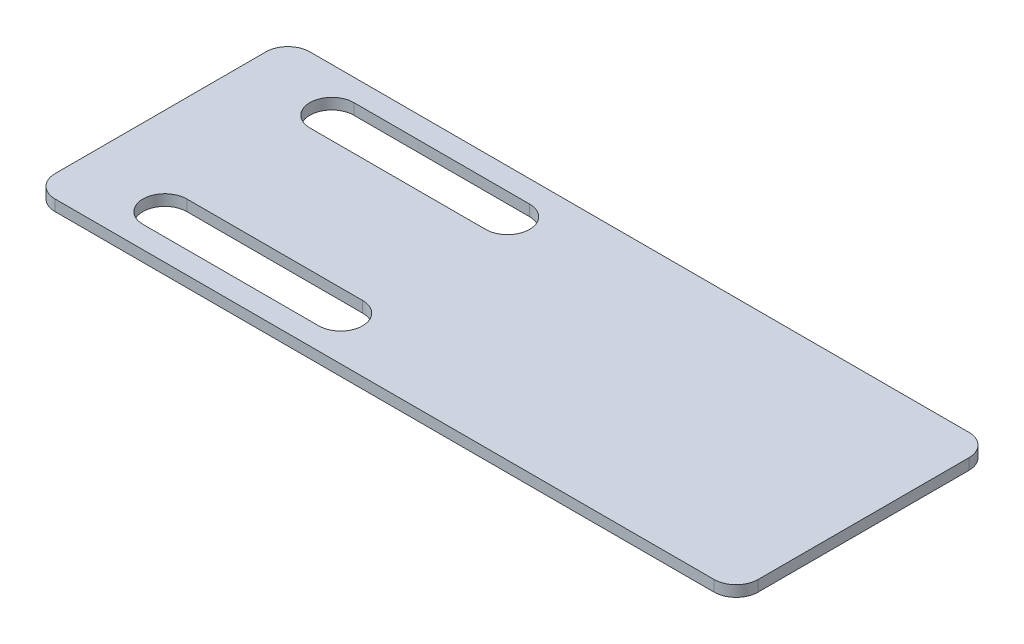
ISO-10303-21;
HEADER;
FILE_DESCRIPTION(('STEP AP214'),'2;1');
FILE_NAME('part.step','',(''),(''),'','','');
FILE_SCHEMA(('AUTOMOTIVE_DESIGN { 1 0 10303 214 1 1 1 1 }'));
ENDSEC;
DATA;
#1=APPLICATION_CONTEXT('core data for automotive mechanical design processes');
#2=APPLICATION_PROTOCOL_DEFINITION('international standard','automotive_design',2000,#1);
#3=PRODUCT_CONTEXT('',#1,'mechanical');
#4=PRODUCT('Part','Part','',(#3));
#5=PRODUCT_RELATED_PRODUCT_CATEGORY('part','',(#4));
#6=PRODUCT_DEFINITION_FORMATION('','',#4);
#7=PRODUCT_DEFINITION_CONTEXT('part definition',#1,'design');
#8=PRODUCT_DEFINITION('design','',#6,#7);
#9=PRODUCT_DEFINITION_SHAPE('','',#8);
#10=(LENGTH_UNIT() NAMED_UNIT(*) SI_UNIT(.MILLI.,.METRE.));
#11=(NAMED_UNIT(*) PLANE_ANGLE_UNIT() SI_UNIT($,.RADIAN.));
#12=(NAMED_UNIT(*) SI_UNIT($,.STERADIAN.) SOLID_ANGLE_UNIT());
#13=UNCERTAINTY_MEASURE_WITH_UNIT(LENGTH_MEASURE(1.E-05),#10,'distance_accuracy_value','');
#14=(GEOMETRIC_REPRESENTATION_CONTEXT(3) GLOBAL_UNCERTAINTY_ASSIGNED_CONTEXT((#13)) GLOBAL_UNIT_ASSIGNED_CONTEXT((#10,
#11,#12)) REPRESENTATION_CONTEXT('',''));
#15=CARTESIAN_POINT('',(0.,0.,0.));
#16=DIRECTION('',(0.,0.,1.));
#17=DIRECTION('',(1.,0.,0.));
#18=AXIS2_PLACEMENT_3D('',#15,#16,#17);
#19=CARTESIAN_POINT('',(0.,3.175,0.));
#20=DIRECTION('',(0.,1.,0.));
#21=DIRECTION('',(0.,0.,1.));
#22=AXIS2_PLACEMENT_3D('',#19,#20,#21);
#23=PLANE('',#22);
#24=DIRECTION('',(0.,0.,1.));
#25=VECTOR('',#24,1.);
#26=CARTESIAN_POINT('',(-101.6,3.175,-36.83));
#27=LINE('',#26,#25);
#28=CARTESIAN_POINT('',(-101.6,3.175,-30.48));
#29=VERTEX_POINT('',#28);
#30=CARTESIAN_POINT('',(-101.6,3.175,30.48));
#31=VERTEX_POINT('',#30);
#32=EDGE_CURVE('E229',#29,#31,#27,.T.);
#33=ORIENTED_EDGE('',*,*,#32,.T.);
#34=CARTESIAN_POINT('',(-95.25,3.175,30.48));
#35=DIRECTION('',(0.,1.,0.));
#36=DIRECTION('',(0.,0.,1.));
#37=AXIS2_PLACEMENT_3D('',#34,#35,#36);
#38=CIRCLE('',#37,6.35);
#39=CARTESIAN_POINT('',(-95.25,3.175,36.83));
#40=VERTEX_POINT('',#39);
#41=EDGE_CURVE('E267',#31,#40,#38,.T.);
#42=ORIENTED_EDGE('',*,*,#41,.T.);
#43=DIRECTION('',(1.,0.,0.));
#44=VECTOR('',#43,1.);
#45=CARTESIAN_POINT('',(-101.6,3.175,36.83));
#46=LINE('',#45,#44);
#47=CARTESIAN_POINT('',(95.25,3.175,36.83));
#48=VERTEX_POINT('',#47);
#49=EDGE_CURVE('E232',#40,#48,#46,.T.);
#50=ORIENTED_EDGE('',*,*,#49,.T.);
#51=CARTESIAN_POINT('',(95.25,3.175,30.48));
#52=DIRECTION('',(0.,1.,0.));
#53=DIRECTION('',(0.,0.,1.));
#54=AXIS2_PLACEMENT_3D('',#51,#52,#53);
#55=CIRCLE('',#54,6.35);
#56=CARTESIAN_POINT('',(101.6,3.175,30.48));
#57=VERTEX_POINT('',#56);
#58=EDGE_CURVE('E262',#48,#57,#55,.T.);
#59=ORIENTED_EDGE('',*,*,#58,.T.);
#60=DIRECTION('',(0.,0.,-1.));
#61=VECTOR('',#60,1.);
#62=CARTESIAN_POINT('',(101.6,3.175,-36.83));
#63=LINE('',#62,#61);
#64=CARTESIAN_POINT('',(101.6,3.175,-30.48));
#65=VERTEX_POINT('',#64);
#66=EDGE_CURVE('E224',#57,#65,#63,.T.);
#67=ORIENTED_EDGE('',*,*,#66,.T.);
#68=CARTESIAN_POINT('',(95.25,3.175,-30.48));
#69=DIRECTION('',(0.,1.,0.));
#70=DIRECTION('',(0.,0.,1.));
#71=AXIS2_PLACEMENT_3D('',#68,#69,#70);
#72=CIRCLE('',#71,6.35);
#73=CARTESIAN_POINT('',(95.25,3.175,-36.83));
#74=VERTEX_POINT('',#73);
#75=EDGE_CURVE('E59',#65,#74,#72,.T.);
#76=ORIENTED_EDGE('',*,*,#75,.T.);
#77=DIRECTION('',(-1.,0.,0.));
#78=VECTOR('',#77,1.);
#79=CARTESIAN_POINT('',(-101.6,3.175,-36.83));
#80=LINE('',#79,#78);
#81=CARTESIAN_POINT('',(-95.25,3.175,-36.83));
#82=VERTEX_POINT('',#81);
#83=EDGE_CURVE('E226',#74,#82,#80,.T.);
#84=ORIENTED_EDGE('',*,*,#83,.T.);
#85=CARTESIAN_POINT('',(-95.25,3.175,-30.48));
#86=DIRECTION('',(0.,1.,0.));
#87=DIRECTION('',(0.,0.,1.));
#88=AXIS2_PLACEMENT_3D('',#85,#86,#87);
#89=CIRCLE('',#88,6.35);
#90=EDGE_CURVE('E265',#82,#29,#89,.T.);
#91=ORIENTED_EDGE('',*,*,#90,.T.);
#92=EDGE_LOOP('',(#33,#42,#50,#59,#67,#76,#84,#91));
#93=FACE_BOUND('',#92,.T.);
#94=DIRECTION('',(1.,0.,0.));
#95=VECTOR('',#94,1.);
#96=CARTESIAN_POINT('',(-76.2,3.175,30.4800000000001));
#97=LINE('',#96,#95);
#98=CARTESIAN_POINT('',(-76.2,3.175,30.4800000000001));
#99=VERTEX_POINT('',#98);
#100=CARTESIAN_POINT('',(-25.4,3.175,30.48));
#101=VERTEX_POINT('',#100);
#102=EDGE_CURVE('E195',#99,#101,#97,.T.);
#103=ORIENTED_EDGE('',*,*,#102,.F.);
#104=CARTESIAN_POINT('',(-76.2,3.175,24.13));
#105=DIRECTION('',(0.,1.,0.));
#106=DIRECTION('',(0.,0.,1.));
#107=AXIS2_PLACEMENT_3D('',#104,#105,#106);
#108=CIRCLE('',#107,6.35000000000002);
#109=CARTESIAN_POINT('',(-76.2,3.175,17.78));
#110=VERTEX_POINT('',#109);
#111=EDGE_CURVE('E193',#110,#99,#108,.T.);
#112=ORIENTED_EDGE('',*,*,#111,.F.);
#113=DIRECTION('',(-1.,0.,0.));
#114=VECTOR('',#113,1.);
#115=CARTESIAN_POINT('',(-76.2,3.175,17.78));
#116=LINE('',#115,#114);
#117=CARTESIAN_POINT('',(-25.4,3.175,17.78));
#118=VERTEX_POINT('',#117);
#119=EDGE_CURVE('E201',#118,#110,#116,.T.);
#120=ORIENTED_EDGE('',*,*,#119,.F.);
#121=CARTESIAN_POINT('',(-25.4,3.175,24.13));
#122=DIRECTION('',(0.,1.,0.));
#123=DIRECTION('',(0.,0.,1.));
#124=AXIS2_PLACEMENT_3D('',#121,#122,#123);
#125=CIRCLE('',#124,6.35000000000002);
#126=EDGE_CURVE('E198',#101,#118,#125,.T.);
#127=ORIENTED_EDGE('',*,*,#126,.F.);
#128=EDGE_LOOP('',(#103,#112,#120,#127));
#129=FACE_BOUND('',#128,.T.);
#130=DIRECTION('',(1.,0.,0.));
#131=VECTOR('',#130,1.);
#132=CARTESIAN_POINT('',(-76.2,3.175,-17.78));
#133=LINE('',#132,#131);
#134=CARTESIAN_POINT('',(-76.2,3.175,-17.78));
#135=VERTEX_POINT('',#134);
#136=CARTESIAN_POINT('',(-25.4,3.175,-17.78));
#137=VERTEX_POINT('',#136);
#138=EDGE_CURVE('E162',#135,#137,#133,.T.);
#139=ORIENTED_EDGE('',*,*,#138,.F.);
#140=CARTESIAN_POINT('',(-76.2,3.175,-24.13));
#141=DIRECTION('',(0.,1.,0.));
#142=DIRECTION('',(0.,0.,-1.));
#143=AXIS2_PLACEMENT_3D('',#140,#141,#142);
#144=CIRCLE('',#143,6.35000000000002);
#145=CARTESIAN_POINT('',(-76.2,3.175,-30.4800000000001));
#146=VERTEX_POINT('',#145);
#147=EDGE_CURVE('E152',#146,#135,#144,.T.);
#148=ORIENTED_EDGE('',*,*,#147,.F.);
#149=DIRECTION('',(-1.,0.,0.));
#150=VECTOR('',#149,1.);
#151=CARTESIAN_POINT('',(-76.2,3.175,-30.4800000000001));
#152=LINE('',#151,#150);
#153=CARTESIAN_POINT('',(-25.4,3.175,-30.4800000000001));
#154=VERTEX_POINT('',#153);
#155=EDGE_CURVE('E177',#154,#146,#152,.T.);
#156=ORIENTED_EDGE('',*,*,#155,.F.);
#157=CARTESIAN_POINT('',(-25.4,3.175,-24.13));
#158=DIRECTION('',(0.,1.,0.));
#159=DIRECTION('',(0.,0.,-1.));
#160=AXIS2_PLACEMENT_3D('',#157,#158,#159);
#161=CIRCLE('',#160,6.35000000000002);
#162=EDGE_CURVE('E175',#137,#154,#161,.T.);
#163=ORIENTED_EDGE('',*,*,#162,.F.);
#164=EDGE_LOOP('',(#139,#148,#156,#163));
#165=FACE_BOUND('',#164,.T.);
#166=ADVANCED_FACE('F37',(#93,#129,#165),#23,.T.);
#167=CARTESIAN_POINT('',(0.,0.,0.));
#168=DIRECTION('',(0.,1.,0.));
#169=DIRECTION('',(0.,0.,1.));
#170=AXIS2_PLACEMENT_3D('',#167,#168,#169);
#171=PLANE('',#170);
#172=CARTESIAN_POINT('',(-76.2,0.,24.13));
#173=DIRECTION('',(0.,1.,0.));
#174=DIRECTION('',(0.,0.,1.));
#175=AXIS2_PLACEMENT_3D('',#172,#173,#174);
#176=CIRCLE('',#175,6.35000000000002);
#177=CARTESIAN_POINT('',(-76.2,0.,17.78));
#178=VERTEX_POINT('',#177);
#179=CARTESIAN_POINT('',(-76.2,0.,30.4800000000001));
#180=VERTEX_POINT('',#179);
#181=EDGE_CURVE('E170',#178,#180,#176,.T.);
#182=ORIENTED_EDGE('',*,*,#181,.T.);
#183=DIRECTION('',(1.,0.,0.));
#184=VECTOR('',#183,1.);
#185=CARTESIAN_POINT('',(-76.2,0.,30.4800000000001));
#186=LINE('',#185,#184);
#187=CARTESIAN_POINT('',(-25.4,0.,30.48));
#188=VERTEX_POINT('',#187);
#189=EDGE_CURVE('E206',#180,#188,#186,.T.);
#190=ORIENTED_EDGE('',*,*,#189,.T.);
#191=CARTESIAN_POINT('',(-25.4,0.,24.13));
#192=DIRECTION('',(0.,1.,0.));
#193=DIRECTION('',(0.,0.,1.));
#194=AXIS2_PLACEMENT_3D('',#191,#192,#193);
#195=CIRCLE('',#194,6.35000000000002);
#196=CARTESIAN_POINT('',(-25.4,0.,17.78));
#197=VERTEX_POINT('',#196);
#198=EDGE_CURVE('E209',#188,#197,#195,.T.);
#199=ORIENTED_EDGE('',*,*,#198,.T.);
#200=DIRECTION('',(-1.,0.,0.));
#201=VECTOR('',#200,1.);
#202=CARTESIAN_POINT('',(-76.2,0.,17.78));
#203=LINE('',#202,#201);
#204=EDGE_CURVE('E196',#197,#178,#203,.T.);
#205=ORIENTED_EDGE('',*,*,#204,.T.);
#206=EDGE_LOOP('',(#182,#190,#199,#205));
#207=FACE_BOUND('',#206,.T.);
#208=DIRECTION('',(1.,0.,0.));
#209=VECTOR('',#208,1.);
#210=CARTESIAN_POINT('',(-101.6,0.,36.83));
#211=LINE('',#210,#209);
#212=CARTESIAN_POINT('',(-95.25,0.,36.83));
#213=VERTEX_POINT('',#212);
#214=CARTESIAN_POINT('',(95.25,0.,36.83));
#215=VERTEX_POINT('',#214);
#216=EDGE_CURVE('E227',#213,#215,#211,.T.);
#217=ORIENTED_EDGE('',*,*,#216,.F.);
#218=CARTESIAN_POINT('',(-95.25,0.,30.48));
#219=DIRECTION('',(0.,1.,0.));
#220=DIRECTION('',(0.,0.,1.));
#221=AXIS2_PLACEMENT_3D('',#218,#219,#220);
#222=CIRCLE('',#221,6.35);
#223=CARTESIAN_POINT('',(-101.6,0.,30.48));
#224=VERTEX_POINT('',#223);
#225=EDGE_CURVE('E255',#213,#224,#222,.F.);
#226=ORIENTED_EDGE('',*,*,#225,.T.);
#227=DIRECTION('',(0.,0.,1.));
#228=VECTOR('',#227,1.);
#229=CARTESIAN_POINT('',(-101.6,0.,-36.83));
#230=LINE('',#229,#228);
#231=CARTESIAN_POINT('',(-101.6,0.,-30.48));
#232=VERTEX_POINT('',#231);
#233=EDGE_CURVE('E240',#232,#224,#230,.T.);
#234=ORIENTED_EDGE('',*,*,#233,.F.);
#235=CARTESIAN_POINT('',(-95.25,0.,-30.48));
#236=DIRECTION('',(0.,1.,0.));
#237=DIRECTION('',(0.,0.,1.));
#238=AXIS2_PLACEMENT_3D('',#235,#236,#237);
#239=CIRCLE('',#238,6.35);
#240=CARTESIAN_POINT('',(-95.25,0.,-36.83));
#241=VERTEX_POINT('',#240);
#242=EDGE_CURVE('E253',#232,#241,#239,.F.);
#243=ORIENTED_EDGE('',*,*,#242,.T.);
#244=DIRECTION('',(-1.,0.,0.));
#245=VECTOR('',#244,1.);
#246=CARTESIAN_POINT('',(-101.6,0.,-36.83));
#247=LINE('',#246,#245);
#248=CARTESIAN_POINT('',(95.25,0.,-36.83));
#249=VERTEX_POINT('',#248);
#250=EDGE_CURVE('E238',#249,#241,#247,.T.);
#251=ORIENTED_EDGE('',*,*,#250,.F.);
#252=CARTESIAN_POINT('',(95.25,0.,-30.48));
#253=DIRECTION('',(0.,1.,0.));
#254=DIRECTION('',(0.,0.,1.));
#255=AXIS2_PLACEMENT_3D('',#252,#253,#254);
#256=CIRCLE('',#255,6.35);
#257=CARTESIAN_POINT('',(101.6,0.,-30.48));
#258=VERTEX_POINT('',#257);
#259=EDGE_CURVE('E251',#249,#258,#256,.F.);
#260=ORIENTED_EDGE('',*,*,#259,.T.);
#261=DIRECTION('',(0.,0.,-1.));
#262=VECTOR('',#261,1.);
#263=CARTESIAN_POINT('',(101.6,0.,-36.83));
#264=LINE('',#263,#262);
#265=CARTESIAN_POINT('',(101.6,0.,30.48));
#266=VERTEX_POINT('',#265);
#267=EDGE_CURVE('E223',#266,#258,#264,.T.);
#268=ORIENTED_EDGE('',*,*,#267,.F.);
#269=CARTESIAN_POINT('',(95.25,0.,30.48));
#270=DIRECTION('',(0.,1.,0.));
#271=DIRECTION('',(0.,0.,1.));
#272=AXIS2_PLACEMENT_3D('',#269,#270,#271);
#273=CIRCLE('',#272,6.35);
#274=EDGE_CURVE('E249',#266,#215,#273,.F.);
#275=ORIENTED_EDGE('',*,*,#274,.T.);
#276=EDGE_LOOP('',(#217,#226,#234,#243,#251,#260,#268,#275));
#277=FACE_BOUND('',#276,.T.);
#278=CARTESIAN_POINT('',(-76.2,0.,-24.13));
#279=DIRECTION('',(0.,1.,0.));
#280=DIRECTION('',(0.,0.,-1.));
#281=AXIS2_PLACEMENT_3D('',#278,#279,#280);
#282=CIRCLE('',#281,6.35000000000002);
#283=CARTESIAN_POINT('',(-76.2,0.,-30.4800000000001));
#284=VERTEX_POINT('',#283);
#285=CARTESIAN_POINT('',(-76.2,0.,-17.78));
#286=VERTEX_POINT('',#285);
#287=EDGE_CURVE('E181',#284,#286,#282,.T.);
#288=ORIENTED_EDGE('',*,*,#287,.T.);
#289=DIRECTION('',(1.,0.,0.));
#290=VECTOR('',#289,1.);
#291=CARTESIAN_POINT('',(-76.2,0.,-17.78));
#292=LINE('',#291,#290);
#293=CARTESIAN_POINT('',(-25.4,0.,-17.78));
#294=VERTEX_POINT('',#293);
#295=EDGE_CURVE('E169',#286,#294,#292,.T.);
#296=ORIENTED_EDGE('',*,*,#295,.T.);
#297=CARTESIAN_POINT('',(-25.4,0.,-24.13));
#298=DIRECTION('',(0.,1.,0.));
#299=DIRECTION('',(0.,0.,-1.));
#300=AXIS2_PLACEMENT_3D('',#297,#298,#299);
#301=CIRCLE('',#300,6.35000000000002);
#302=CARTESIAN_POINT('',(-25.4,0.,-30.48));
#303=VERTEX_POINT('',#302);
#304=EDGE_CURVE('E184',#294,#303,#301,.T.);
#305=ORIENTED_EDGE('',*,*,#304,.T.);
#306=DIRECTION('',(-1.,0.,0.));
#307=VECTOR('',#306,1.);
#308=CARTESIAN_POINT('',(-76.2,0.,-30.4800000000001));
#309=LINE('',#308,#307);
#310=EDGE_CURVE('E163',#303,#284,#309,.T.);
#311=ORIENTED_EDGE('',*,*,#310,.T.);
#312=EDGE_LOOP('',(#288,#296,#305,#311));
#313=FACE_BOUND('',#312,.T.);
#314=ADVANCED_FACE('F283',(#207,#277,#313),#171,.F.);
#315=CARTESIAN_POINT('',(101.6,3.175,-36.83));
#316=DIRECTION('',(-1.,0.,0.));
#317=DIRECTION('',(0.,0.,1.));
#318=AXIS2_PLACEMENT_3D('',#315,#316,#317);
#319=PLANE('',#318);
#320=ORIENTED_EDGE('',*,*,#267,.T.);
#321=DIRECTION('',(0.,-1.,0.));
#322=VECTOR('',#321,1.);
#323=CARTESIAN_POINT('',(101.6,3.175,-30.48));
#324=LINE('',#323,#322);
#325=EDGE_CURVE('E11',#258,#65,#324,.F.);
#326=ORIENTED_EDGE('',*,*,#325,.T.);
#327=ORIENTED_EDGE('',*,*,#66,.F.);
#328=DIRECTION('',(0.,-1.,0.));
#329=VECTOR('',#328,1.);
#330=CARTESIAN_POINT('',(101.6,3.175,30.48));
#331=LINE('',#330,#329);
#332=EDGE_CURVE('E45',#57,#266,#331,.T.);
#333=ORIENTED_EDGE('',*,*,#332,.T.);
#334=EDGE_LOOP('',(#320,#326,#327,#333));
#335=FACE_BOUND('',#334,.T.);
#336=ADVANCED_FACE('F277',(#335),#319,.F.);
#337=CARTESIAN_POINT('',(-101.6,3.175,-36.83));
#338=DIRECTION('',(0.,0.,1.));
#339=DIRECTION('',(1.,0.,0.));
#340=AXIS2_PLACEMENT_3D('',#337,#338,#339);
#341=PLANE('',#340);
#342=ORIENTED_EDGE('',*,*,#250,.T.);
#343=DIRECTION('',(0.,-1.,0.));
#344=VECTOR('',#343,1.);
#345=CARTESIAN_POINT('',(-95.25,3.175,-36.83));
#346=LINE('',#345,#344);
#347=EDGE_CURVE('E52',#241,#82,#346,.F.);
#348=ORIENTED_EDGE('',*,*,#347,.T.);
#349=ORIENTED_EDGE('',*,*,#83,.F.);
#350=DIRECTION('',(0.,-1.,0.));
#351=VECTOR('',#350,1.);
#352=CARTESIAN_POINT('',(95.25,3.175,-36.83));
#353=LINE('',#352,#351);
#354=EDGE_CURVE('E269',#74,#249,#353,.T.);
#355=ORIENTED_EDGE('',*,*,#354,.T.);
#356=EDGE_LOOP('',(#342,#348,#349,#355));
#357=FACE_BOUND('',#356,.T.);
#358=ADVANCED_FACE('F289',(#357),#341,.F.);
#359=CARTESIAN_POINT('',(-101.6,3.175,-36.83));
#360=DIRECTION('',(1.,0.,0.));
#361=DIRECTION('',(0.,0.,-1.));
#362=AXIS2_PLACEMENT_3D('',#359,#360,#361);
#363=PLANE('',#362);
#364=ORIENTED_EDGE('',*,*,#233,.T.);
#365=DIRECTION('',(0.,-1.,0.));
#366=VECTOR('',#365,1.);
#367=CARTESIAN_POINT('',(-101.6,3.175,30.48));
#368=LINE('',#367,#366);
#369=EDGE_CURVE('E260',#224,#31,#368,.F.);
#370=ORIENTED_EDGE('',*,*,#369,.T.);
#371=ORIENTED_EDGE('',*,*,#32,.F.);
#372=DIRECTION('',(0.,-1.,0.));
#373=VECTOR('',#372,1.);
#374=CARTESIAN_POINT('',(-101.6,3.175,-30.48));
#375=LINE('',#374,#373);
#376=EDGE_CURVE('E257',#29,#232,#375,.T.);
#377=ORIENTED_EDGE('',*,*,#376,.T.);
#378=EDGE_LOOP('',(#364,#370,#371,#377));
#379=FACE_BOUND('',#378,.T.);
#380=ADVANCED_FACE('F298',(#379),#363,.F.);
#381=CARTESIAN_POINT('',(-101.6,3.175,36.83));
#382=DIRECTION('',(0.,0.,-1.));
#383=DIRECTION('',(-1.,0.,0.));
#384=AXIS2_PLACEMENT_3D('',#381,#382,#383);
#385=PLANE('',#384);
#386=ORIENTED_EDGE('',*,*,#49,.F.);
#387=DIRECTION('',(0.,-1.,0.));
#388=VECTOR('',#387,1.);
#389=CARTESIAN_POINT('',(-95.25,3.175,36.83));
#390=LINE('',#389,#388);
#391=EDGE_CURVE('E246',#40,#213,#390,.T.);
#392=ORIENTED_EDGE('',*,*,#391,.T.);
#393=ORIENTED_EDGE('',*,*,#216,.T.);
#394=DIRECTION('',(0.,-1.,0.));
#395=VECTOR('',#394,1.);
#396=CARTESIAN_POINT('',(95.25,3.175,36.83));
#397=LINE('',#396,#395);
#398=EDGE_CURVE('E235',#215,#48,#397,.F.);
#399=ORIENTED_EDGE('',*,*,#398,.T.);
#400=EDGE_LOOP('',(#386,#392,#393,#399));
#401=FACE_BOUND('',#400,.T.);
#402=ADVANCED_FACE('F306',(#401),#385,.F.);
#403=CARTESIAN_POINT('',(-76.2,3.175,24.13));
#404=DIRECTION('',(0.,-1.,0.));
#405=DIRECTION('',(0.,0.,-1.));
#406=AXIS2_PLACEMENT_3D('',#403,#404,#405);
#407=CYLINDRICAL_SURFACE('',#406,6.35000000000002);
#408=ORIENTED_EDGE('',*,*,#181,.F.);
#409=DIRECTION('',(0.,-1.,0.));
#410=VECTOR('',#409,1.);
#411=CARTESIAN_POINT('',(-76.2,3.175,17.78));
#412=LINE('',#411,#410);
#413=EDGE_CURVE('E203',#110,#178,#412,.T.);
#414=ORIENTED_EDGE('',*,*,#413,.F.);
#415=ORIENTED_EDGE('',*,*,#111,.T.);
#416=DIRECTION('',(0.,-1.,0.));
#417=VECTOR('',#416,1.);
#418=CARTESIAN_POINT('',(-76.2,3.175,30.4800000000001));
#419=LINE('',#418,#417);
#420=EDGE_CURVE('E220',#99,#180,#419,.T.);
#421=ORIENTED_EDGE('',*,*,#420,.T.);
#422=EDGE_LOOP('',(#408,#414,#415,#421));
#423=FACE_BOUND('',#422,.T.);
#424=ADVANCED_FACE('F320',(#423),#407,.F.);
#425=CARTESIAN_POINT('',(-76.2,3.175,30.4800000000001));
#426=DIRECTION('',(0.,0.,-1.));
#427=DIRECTION('',(-1.,0.,0.));
#428=AXIS2_PLACEMENT_3D('',#425,#426,#427);
#429=PLANE('',#428);
#430=ORIENTED_EDGE('',*,*,#189,.F.);
#431=ORIENTED_EDGE('',*,*,#420,.F.);
#432=ORIENTED_EDGE('',*,*,#102,.T.);
#433=DIRECTION('',(0.,-1.,0.));
#434=VECTOR('',#433,1.);
#435=CARTESIAN_POINT('',(-25.4,3.175,30.48));
#436=LINE('',#435,#434);
#437=EDGE_CURVE('E218',#101,#188,#436,.T.);
#438=ORIENTED_EDGE('',*,*,#437,.T.);
#439=EDGE_LOOP('',(#430,#431,#432,#438));
#440=FACE_BOUND('',#439,.T.);
#441=ADVANCED_FACE('F405',(#440),#429,.T.);
#442=CARTESIAN_POINT('',(-25.4,3.175,24.13));
#443=DIRECTION('',(0.,-1.,0.));
#444=DIRECTION('',(0.,0.,-1.));
#445=AXIS2_PLACEMENT_3D('',#442,#443,#444);
#446=CYLINDRICAL_SURFACE('',#445,6.35000000000002);
#447=ORIENTED_EDGE('',*,*,#198,.F.);
#448=ORIENTED_EDGE('',*,*,#437,.F.);
#449=ORIENTED_EDGE('',*,*,#126,.T.);
#450=DIRECTION('',(0.,-1.,0.));
#451=VECTOR('',#450,1.);
#452=CARTESIAN_POINT('',(-25.4,3.175,17.78));
#453=LINE('',#452,#451);
#454=EDGE_CURVE('E216',#118,#197,#453,.T.);
#455=ORIENTED_EDGE('',*,*,#454,.T.);
#456=EDGE_LOOP('',(#447,#448,#449,#455));
#457=FACE_BOUND('',#456,.T.);
#458=ADVANCED_FACE('F396',(#457),#446,.F.);
#459=CARTESIAN_POINT('',(-76.2,3.175,17.78));
#460=DIRECTION('',(0.,0.,1.));
#461=DIRECTION('',(1.,0.,0.));
#462=AXIS2_PLACEMENT_3D('',#459,#460,#461);
#463=PLANE('',#462);
#464=ORIENTED_EDGE('',*,*,#204,.F.);
#465=ORIENTED_EDGE('',*,*,#454,.F.);
#466=ORIENTED_EDGE('',*,*,#119,.T.);
#467=ORIENTED_EDGE('',*,*,#413,.T.);
#468=EDGE_LOOP('',(#464,#465,#466,#467));
#469=FACE_BOUND('',#468,.T.);
#470=ADVANCED_FACE('F388',(#469),#463,.T.);
#471=CARTESIAN_POINT('',(-76.2,3.175,-24.13));
#472=DIRECTION('',(0.,-1.,0.));
#473=DIRECTION('',(0.,0.,-1.));
#474=AXIS2_PLACEMENT_3D('',#471,#472,#473);
#475=CYLINDRICAL_SURFACE('',#474,6.35000000000002);
#476=ORIENTED_EDGE('',*,*,#287,.F.);
#477=DIRECTION('',(0.,-1.,0.));
#478=VECTOR('',#477,1.);
#479=CARTESIAN_POINT('',(-76.2,3.175,-30.4800000000001));
#480=LINE('',#479,#478);
#481=EDGE_CURVE('E158',#146,#284,#480,.T.);
#482=ORIENTED_EDGE('',*,*,#481,.F.);
#483=ORIENTED_EDGE('',*,*,#147,.T.);
#484=DIRECTION('',(0.,-1.,0.));
#485=VECTOR('',#484,1.);
#486=CARTESIAN_POINT('',(-76.2,3.175,-17.78));
#487=LINE('',#486,#485);
#488=EDGE_CURVE('E155',#135,#286,#487,.T.);
#489=ORIENTED_EDGE('',*,*,#488,.T.);
#490=EDGE_LOOP('',(#476,#482,#483,#489));
#491=FACE_BOUND('',#490,.T.);
#492=ADVANCED_FACE('F154',(#491),#475,.F.);
#493=CARTESIAN_POINT('',(-76.2,3.175,-17.78));
#494=DIRECTION('',(0.,0.,-1.));
#495=DIRECTION('',(-1.,0.,0.));
#496=AXIS2_PLACEMENT_3D('',#493,#494,#495);
#497=PLANE('',#496);
#498=ORIENTED_EDGE('',*,*,#295,.F.);
#499=ORIENTED_EDGE('',*,*,#488,.F.);
#500=ORIENTED_EDGE('',*,*,#138,.T.);
#501=DIRECTION('',(0.,-1.,0.));
#502=VECTOR('',#501,1.);
#503=CARTESIAN_POINT('',(-25.4,3.175,-17.78));
#504=LINE('',#503,#502);
#505=EDGE_CURVE('E171',#137,#294,#504,.T.);
#506=ORIENTED_EDGE('',*,*,#505,.T.);
#507=EDGE_LOOP('',(#498,#499,#500,#506));
#508=FACE_BOUND('',#507,.T.);
#509=ADVANCED_FACE('F166',(#508),#497,.T.);
#510=CARTESIAN_POINT('',(-25.4,3.175,-24.13));
#511=DIRECTION('',(0.,-1.,0.));
#512=DIRECTION('',(0.,0.,-1.));
#513=AXIS2_PLACEMENT_3D('',#510,#511,#512);
#514=CYLINDRICAL_SURFACE('',#513,6.35000000000002);
#515=ORIENTED_EDGE('',*,*,#304,.F.);
#516=ORIENTED_EDGE('',*,*,#505,.F.);
#517=ORIENTED_EDGE('',*,*,#162,.T.);
#518=DIRECTION('',(0.,-1.,0.));
#519=VECTOR('',#518,1.);
#520=CARTESIAN_POINT('',(-25.4,3.175,-30.48));
#521=LINE('',#520,#519);
#522=EDGE_CURVE('E190',#154,#303,#521,.T.);
#523=ORIENTED_EDGE('',*,*,#522,.T.);
#524=EDGE_LOOP('',(#515,#516,#517,#523));
#525=FACE_BOUND('',#524,.T.);
#526=ADVANCED_FACE('F364',(#525),#514,.F.);
#527=CARTESIAN_POINT('',(-76.2,3.175,-30.4800000000001));
#528=DIRECTION('',(0.,0.,1.));
#529=DIRECTION('',(1.,0.,0.));
#530=AXIS2_PLACEMENT_3D('',#527,#528,#529);
#531=PLANE('',#530);
#532=ORIENTED_EDGE('',*,*,#310,.F.);
#533=ORIENTED_EDGE('',*,*,#522,.F.);
#534=ORIENTED_EDGE('',*,*,#155,.T.);
#535=ORIENTED_EDGE('',*,*,#481,.T.);
#536=EDGE_LOOP('',(#532,#533,#534,#535));
#537=FACE_BOUND('',#536,.T.);
#538=ADVANCED_FACE('F333',(#537),#531,.T.);
#539=CARTESIAN_POINT('',(-95.25,3.175,30.48));
#540=DIRECTION('',(0.,-1.,0.));
#541=DIRECTION('',(0.,0.,-1.));
#542=AXIS2_PLACEMENT_3D('',#539,#540,#541);
#543=CYLINDRICAL_SURFACE('',#542,6.35);
#544=ORIENTED_EDGE('',*,*,#41,.F.);
#545=ORIENTED_EDGE('',*,*,#369,.F.);
#546=ORIENTED_EDGE('',*,*,#225,.F.);
#547=ORIENTED_EDGE('',*,*,#391,.F.);
#548=EDGE_LOOP('',(#544,#545,#546,#547));
#549=FACE_BOUND('',#548,.T.);
#550=ADVANCED_FACE('F303',(#549),#543,.T.);
#551=CARTESIAN_POINT('',(-95.25,3.175,-30.48));
#552=DIRECTION('',(0.,-1.,0.));
#553=DIRECTION('',(0.,0.,-1.));
#554=AXIS2_PLACEMENT_3D('',#551,#552,#553);
#555=CYLINDRICAL_SURFACE('',#554,6.35);
#556=ORIENTED_EDGE('',*,*,#90,.F.);
#557=ORIENTED_EDGE('',*,*,#347,.F.);
#558=ORIENTED_EDGE('',*,*,#242,.F.);
#559=ORIENTED_EDGE('',*,*,#376,.F.);
#560=EDGE_LOOP('',(#556,#557,#558,#559));
#561=FACE_BOUND('',#560,.T.);
#562=ADVANCED_FACE('F295',(#561),#555,.T.);
#563=CARTESIAN_POINT('',(95.25,3.175,-30.48));
#564=DIRECTION('',(0.,-1.,0.));
#565=DIRECTION('',(0.,0.,-1.));
#566=AXIS2_PLACEMENT_3D('',#563,#564,#565);
#567=CYLINDRICAL_SURFACE('',#566,6.35);
#568=ORIENTED_EDGE('',*,*,#75,.F.);
#569=ORIENTED_EDGE('',*,*,#325,.F.);
#570=ORIENTED_EDGE('',*,*,#259,.F.);
#571=ORIENTED_EDGE('',*,*,#354,.F.);
#572=EDGE_LOOP('',(#568,#569,#570,#571));
#573=FACE_BOUND('',#572,.T.);
#574=ADVANCED_FACE('F288',(#573),#567,.T.);
#575=CARTESIAN_POINT('',(95.25,3.175,30.48));
#576=DIRECTION('',(0.,-1.,0.));
#577=DIRECTION('',(0.,0.,-1.));
#578=AXIS2_PLACEMENT_3D('',#575,#576,#577);
#579=CYLINDRICAL_SURFACE('',#578,6.35);
#580=ORIENTED_EDGE('',*,*,#58,.F.);
#581=ORIENTED_EDGE('',*,*,#398,.F.);
#582=ORIENTED_EDGE('',*,*,#274,.F.);
#583=ORIENTED_EDGE('',*,*,#332,.F.);
#584=EDGE_LOOP('',(#580,#581,#582,#583));
#585=FACE_BOUND('',#584,.T.);
#586=ADVANCED_FACE('F39',(#585),#579,.T.);
#587=CLOSED_SHELL('',(#166,#314,#336,#358,#380,#402,#424,#441,#458,#470,#492,#509,#526,#538,
#550,#562,#574,#586));
#588=MANIFOLD_SOLID_BREP('B2',#587);
#589=ADVANCED_BREP_SHAPE_REPRESENTATION('',(#18,#588),#14);
#590=SHAPE_DEFINITION_REPRESENTATION(#9,#589);
ENDSEC;
END-ISO-10303-21;
